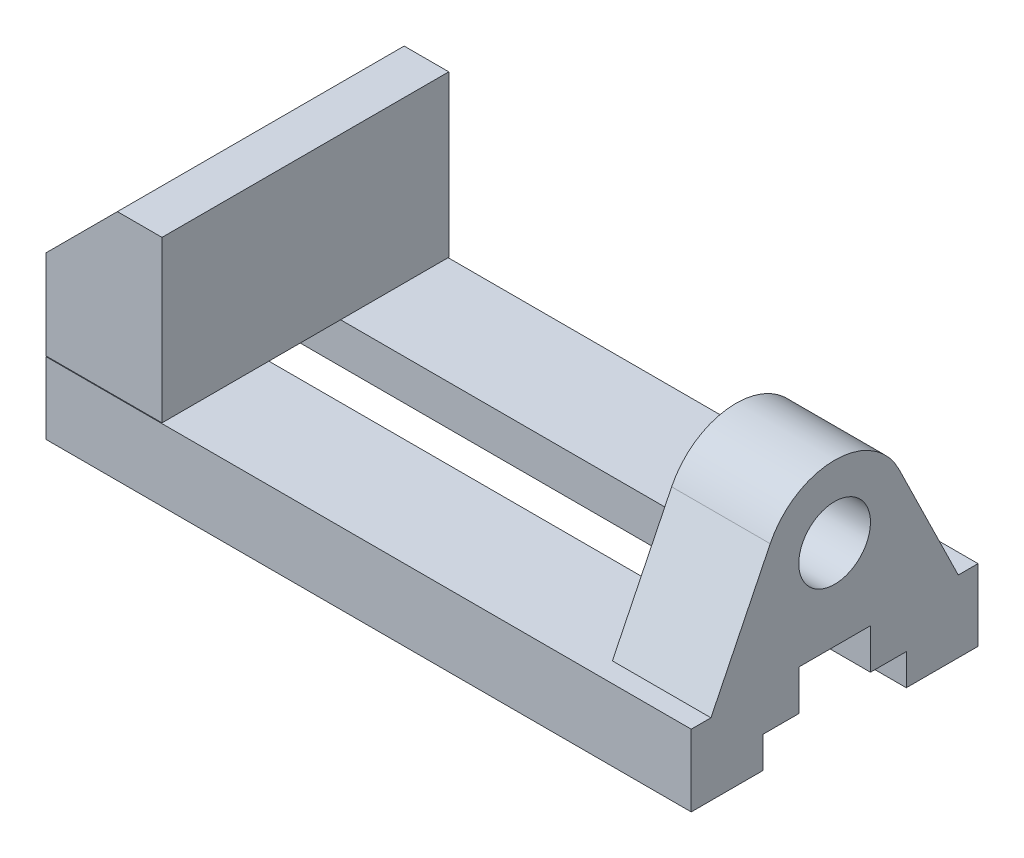
ISO-10303-21;
HEADER;
FILE_DESCRIPTION(('STEP AP214'),'2;1');
FILE_NAME('part.step','',(''),(''),'','','');
FILE_SCHEMA(('AUTOMOTIVE_DESIGN { 1 0 10303 214 1 1 1 1 }'));
ENDSEC;
DATA;
#1=APPLICATION_CONTEXT('core data for automotive mechanical design processes');
#2=APPLICATION_PROTOCOL_DEFINITION('international standard','automotive_design',2000,#1);
#3=PRODUCT_CONTEXT('',#1,'mechanical');
#4=PRODUCT('Part','Part','',(#3));
#5=PRODUCT_RELATED_PRODUCT_CATEGORY('part','',(#4));
#6=PRODUCT_DEFINITION_FORMATION('','',#4);
#7=PRODUCT_DEFINITION_CONTEXT('part definition',#1,'design');
#8=PRODUCT_DEFINITION('design','',#6,#7);
#9=PRODUCT_DEFINITION_SHAPE('','',#8);
#10=(LENGTH_UNIT() NAMED_UNIT(*) SI_UNIT(.MILLI.,.METRE.));
#11=(NAMED_UNIT(*) PLANE_ANGLE_UNIT() SI_UNIT($,.RADIAN.));
#12=(NAMED_UNIT(*) SI_UNIT($,.STERADIAN.) SOLID_ANGLE_UNIT());
#13=UNCERTAINTY_MEASURE_WITH_UNIT(LENGTH_MEASURE(1.E-05),#10,'distance_accuracy_value','');
#14=(GEOMETRIC_REPRESENTATION_CONTEXT(3) GLOBAL_UNCERTAINTY_ASSIGNED_CONTEXT((#13)) GLOBAL_UNIT_ASSIGNED_CONTEXT((#10,
#11,#12)) REPRESENTATION_CONTEXT('',''));
#15=CARTESIAN_POINT('',(0.,0.,0.));
#16=DIRECTION('',(0.,0.,1.));
#17=DIRECTION('',(1.,0.,0.));
#18=AXIS2_PLACEMENT_3D('',#15,#16,#17);
#19=CARTESIAN_POINT('',(-72.,8.15004747972741,-32.));
#20=DIRECTION('',(-1.,0.,0.));
#21=DIRECTION('',(0.,0.,1.));
#22=AXIS2_PLACEMENT_3D('',#19,#20,#21);
#23=PLANE('',#22);
#24=DIRECTION('',(0.,-1.,0.));
#25=VECTOR('',#24,1.);
#26=CARTESIAN_POINT('',(-72.,8.15004747972741,32.));
#27=LINE('',#26,#25);
#28=CARTESIAN_POINT('',(-72.,28.0666877687677,32.));
#29=VERTEX_POINT('',#28);
#30=CARTESIAN_POINT('',(-72.,8.15004747972741,32.));
#31=VERTEX_POINT('',#30);
#32=EDGE_CURVE('E120',#29,#31,#27,.T.);
#33=ORIENTED_EDGE('',*,*,#32,.F.);
#34=DIRECTION('',(0.,0.,1.));
#35=VECTOR('',#34,1.);
#36=CARTESIAN_POINT('',(-72.,28.0666877687677,-32.));
#37=LINE('',#36,#35);
#38=CARTESIAN_POINT('',(-72.,28.0666877687677,-32.));
#39=VERTEX_POINT('',#38);
#40=EDGE_CURVE('E12',#39,#29,#37,.T.);
#41=ORIENTED_EDGE('',*,*,#40,.F.);
#42=DIRECTION('',(0.,-1.,0.));
#43=VECTOR('',#42,1.);
#44=CARTESIAN_POINT('',(-72.,8.15004747972741,-32.));
#45=LINE('',#44,#43);
#46=CARTESIAN_POINT('',(-72.,8.15004747972741,-32.));
#47=VERTEX_POINT('',#46);
#48=EDGE_CURVE('E115',#39,#47,#45,.T.);
#49=ORIENTED_EDGE('',*,*,#48,.T.);
#50=DIRECTION('',(0.,0.,1.));
#51=VECTOR('',#50,1.);
#52=CARTESIAN_POINT('',(-72.,8.15004747972741,-32.));
#53=LINE('',#52,#51);
#54=EDGE_CURVE('E46',#47,#31,#53,.T.);
#55=ORIENTED_EDGE('',*,*,#54,.T.);
#56=EDGE_LOOP('',(#33,#41,#49,#55));
#57=FACE_BOUND('',#56,.T.);
#58=ADVANCED_FACE('F43',(#57),#23,.T.);
#59=CARTESIAN_POINT('',(-56.0666877687677,44.,-32.));
#60=DIRECTION('',(-0.707106781186547,0.707106781186548,0.));
#61=DIRECTION('',(-0.707106781186548,-0.707106781186547,0.));
#62=AXIS2_PLACEMENT_3D('',#59,#60,#61);
#63=PLANE('',#62);
#64=DIRECTION('',(-0.707106781186548,-0.707106781186548,0.));
#65=VECTOR('',#64,1.);
#66=CARTESIAN_POINT('',(-56.0666877687677,44.,32.));
#67=LINE('',#66,#65);
#68=CARTESIAN_POINT('',(-56.0666877687677,44.,32.));
#69=VERTEX_POINT('',#68);
#70=EDGE_CURVE('E129',#69,#29,#67,.T.);
#71=ORIENTED_EDGE('',*,*,#70,.F.);
#72=DIRECTION('',(0.,0.,1.));
#73=VECTOR('',#72,1.);
#74=CARTESIAN_POINT('',(-56.0666877687677,44.,-32.));
#75=LINE('',#74,#73);
#76=CARTESIAN_POINT('',(-56.0666877687677,44.,-32.));
#77=VERTEX_POINT('',#76);
#78=EDGE_CURVE('E52',#77,#69,#75,.T.);
#79=ORIENTED_EDGE('',*,*,#78,.F.);
#80=DIRECTION('',(-0.707106781186548,-0.707106781186548,0.));
#81=VECTOR('',#80,1.);
#82=CARTESIAN_POINT('',(-56.0666877687677,44.,-32.));
#83=LINE('',#82,#81);
#84=EDGE_CURVE('E110',#77,#39,#83,.T.);
#85=ORIENTED_EDGE('',*,*,#84,.T.);
#86=ORIENTED_EDGE('',*,*,#40,.T.);
#87=EDGE_LOOP('',(#71,#79,#85,#86));
#88=FACE_BOUND('',#87,.T.);
#89=ADVANCED_FACE('F135',(#88),#63,.T.);
#90=CARTESIAN_POINT('',(-56.0666877687677,44.,-32.));
#91=DIRECTION('',(0.,1.,0.));
#92=DIRECTION('',(0.,0.,1.));
#93=AXIS2_PLACEMENT_3D('',#90,#91,#92);
#94=PLANE('',#93);
#95=DIRECTION('',(-1.,0.,0.));
#96=VECTOR('',#95,1.);
#97=CARTESIAN_POINT('',(-56.0666877687677,44.,32.));
#98=LINE('',#97,#96);
#99=CARTESIAN_POINT('',(-46.1083676242476,44.,32.));
#100=VERTEX_POINT('',#99);
#101=EDGE_CURVE('E99',#100,#69,#98,.T.);
#102=ORIENTED_EDGE('',*,*,#101,.F.);
#103=DIRECTION('',(0.,0.,1.));
#104=VECTOR('',#103,1.);
#105=CARTESIAN_POINT('',(-46.1083676242476,44.,-32.));
#106=LINE('',#105,#104);
#107=CARTESIAN_POINT('',(-46.1083676242476,44.,-32.));
#108=VERTEX_POINT('',#107);
#109=EDGE_CURVE('E94',#108,#100,#106,.T.);
#110=ORIENTED_EDGE('',*,*,#109,.F.);
#111=DIRECTION('',(-1.,0.,0.));
#112=VECTOR('',#111,1.);
#113=CARTESIAN_POINT('',(-56.0666877687677,44.,-32.));
#114=LINE('',#113,#112);
#115=EDGE_CURVE('E97',#108,#77,#114,.T.);
#116=ORIENTED_EDGE('',*,*,#115,.T.);
#117=ORIENTED_EDGE('',*,*,#78,.T.);
#118=EDGE_LOOP('',(#102,#110,#116,#117));
#119=FACE_BOUND('',#118,.T.);
#120=ADVANCED_FACE('F96',(#119),#94,.T.);
#121=CARTESIAN_POINT('',(-46.1083676242476,8.15004747972741,-32.));
#122=DIRECTION('',(1.,0.,0.));
#123=DIRECTION('',(0.,0.,-1.));
#124=AXIS2_PLACEMENT_3D('',#121,#122,#123);
#125=PLANE('',#124);
#126=DIRECTION('',(0.,1.,0.));
#127=VECTOR('',#126,1.);
#128=CARTESIAN_POINT('',(-46.1083676242476,8.15004747972741,32.));
#129=LINE('',#128,#127);
#130=CARTESIAN_POINT('',(-46.1083676242476,8.15004747972741,32.));
#131=VERTEX_POINT('',#130);
#132=EDGE_CURVE('E126',#131,#100,#129,.T.);
#133=ORIENTED_EDGE('',*,*,#132,.F.);
#134=DIRECTION('',(0.,0.,1.));
#135=VECTOR('',#134,1.);
#136=CARTESIAN_POINT('',(-46.1083676242476,8.15004747972741,-32.));
#137=LINE('',#136,#135);
#138=CARTESIAN_POINT('',(-46.1083676242476,8.15004747972741,-32.));
#139=VERTEX_POINT('',#138);
#140=EDGE_CURVE('E104',#139,#131,#137,.T.);
#141=ORIENTED_EDGE('',*,*,#140,.F.);
#142=DIRECTION('',(0.,1.,0.));
#143=VECTOR('',#142,1.);
#144=CARTESIAN_POINT('',(-46.1083676242476,8.15004747972741,-32.));
#145=LINE('',#144,#143);
#146=EDGE_CURVE('E109',#139,#108,#145,.T.);
#147=ORIENTED_EDGE('',*,*,#146,.T.);
#148=ORIENTED_EDGE('',*,*,#109,.T.);
#149=EDGE_LOOP('',(#133,#141,#147,#148));
#150=FACE_BOUND('',#149,.T.);
#151=ADVANCED_FACE('F112',(#150),#125,.T.);
#152=CARTESIAN_POINT('',(-72.,8.15004747972741,-32.));
#153=DIRECTION('',(0.,-1.,0.));
#154=DIRECTION('',(1.,0.,0.));
#155=AXIS2_PLACEMENT_3D('',#152,#153,#154);
#156=PLANE('',#155);
#157=DIRECTION('',(1.,0.,0.));
#158=VECTOR('',#157,1.);
#159=CARTESIAN_POINT('',(-72.,8.15004747972741,32.));
#160=LINE('',#159,#158);
#161=EDGE_CURVE('E123',#31,#131,#160,.T.);
#162=ORIENTED_EDGE('',*,*,#161,.F.);
#163=ORIENTED_EDGE('',*,*,#54,.F.);
#164=DIRECTION('',(1.,0.,0.));
#165=VECTOR('',#164,1.);
#166=CARTESIAN_POINT('',(-72.,8.15004747972741,-32.));
#167=LINE('',#166,#165);
#168=EDGE_CURVE('E113',#47,#139,#167,.T.);
#169=ORIENTED_EDGE('',*,*,#168,.T.);
#170=ORIENTED_EDGE('',*,*,#140,.T.);
#171=EDGE_LOOP('',(#162,#163,#169,#170));
#172=FACE_BOUND('',#171,.T.);
#173=ADVANCED_FACE('F132',(#172),#156,.T.);
#174=CARTESIAN_POINT('',(0.,0.,-32.));
#175=DIRECTION('',(0.,0.,-1.));
#176=DIRECTION('',(-1.,0.,0.));
#177=AXIS2_PLACEMENT_3D('',#174,#175,#176);
#178=PLANE('',#177);
#179=ORIENTED_EDGE('',*,*,#48,.F.);
#180=ORIENTED_EDGE('',*,*,#84,.F.);
#181=ORIENTED_EDGE('',*,*,#115,.F.);
#182=ORIENTED_EDGE('',*,*,#146,.F.);
#183=ORIENTED_EDGE('',*,*,#168,.F.);
#184=EDGE_LOOP('',(#179,#180,#181,#182,#183));
#185=FACE_BOUND('',#184,.T.);
#186=ADVANCED_FACE('F108',(#185),#178,.T.);
#187=CARTESIAN_POINT('',(0.,0.,32.));
#188=DIRECTION('',(0.,0.,-1.));
#189=DIRECTION('',(-1.,0.,0.));
#190=AXIS2_PLACEMENT_3D('',#187,#188,#189);
#191=PLANE('',#190);
#192=ORIENTED_EDGE('',*,*,#32,.T.);
#193=ORIENTED_EDGE('',*,*,#161,.T.);
#194=ORIENTED_EDGE('',*,*,#132,.T.);
#195=ORIENTED_EDGE('',*,*,#101,.T.);
#196=ORIENTED_EDGE('',*,*,#70,.T.);
#197=EDGE_LOOP('',(#192,#193,#194,#195,#196));
#198=FACE_BOUND('',#197,.T.);
#199=ADVANCED_FACE('F134',(#198),#191,.F.);
#200=CLOSED_SHELL('',(#58,#89,#120,#151,#173,#186,#199));
#201=MANIFOLD_SOLID_BREP('B2',#200);
#202=CARTESIAN_POINT('',(-72.,7.99999999999999,32.));
#203=DIRECTION('',(1.,0.,0.));
#204=DIRECTION('',(0.,0.,-1.));
#205=AXIS2_PLACEMENT_3D('',#202,#203,#204);
#206=PLANE('',#205);
#207=DIRECTION('',(0.,0.,1.));
#208=VECTOR('',#207,1.);
#209=CARTESIAN_POINT('',(-72.,-0.999999999999851,-16.));
#210=LINE('',#209,#208);
#211=CARTESIAN_POINT('',(-72.,-0.999999999999851,-16.));
#212=VERTEX_POINT('',#211);
#213=CARTESIAN_POINT('',(-72.,-0.999999999999854,-8.00000000000001));
#214=VERTEX_POINT('',#213);
#215=EDGE_CURVE('E347',#212,#214,#210,.T.);
#216=ORIENTED_EDGE('',*,*,#215,.T.);
#217=DIRECTION('',(0.,1.,0.));
#218=VECTOR('',#217,1.);
#219=CARTESIAN_POINT('',(-72.,-0.999999999999854,-8.00000000000001));
#220=LINE('',#219,#218);
#221=CARTESIAN_POINT('',(-72.,8.00000000000014,-8.));
#222=VERTEX_POINT('',#221);
#223=EDGE_CURVE('E323',#214,#222,#220,.T.);
#224=ORIENTED_EDGE('',*,*,#223,.T.);
#225=DIRECTION('',(0.,0.,-1.));
#226=VECTOR('',#225,1.);
#227=CARTESIAN_POINT('',(-72.,7.99999999999999,32.));
#228=LINE('',#227,#226);
#229=CARTESIAN_POINT('',(-72.,7.99999999999999,-32.));
#230=VERTEX_POINT('',#229);
#231=EDGE_CURVE('E427',#222,#230,#228,.T.);
#232=ORIENTED_EDGE('',*,*,#231,.T.);
#233=DIRECTION('',(0.,-1.,0.));
#234=VECTOR('',#233,1.);
#235=CARTESIAN_POINT('',(-72.,7.99999999999999,-32.));
#236=LINE('',#235,#234);
#237=CARTESIAN_POINT('',(-72.,-8.00000000000001,-32.));
#238=VERTEX_POINT('',#237);
#239=EDGE_CURVE('E415',#230,#238,#236,.T.);
#240=ORIENTED_EDGE('',*,*,#239,.T.);
#241=DIRECTION('',(0.,0.,-1.));
#242=VECTOR('',#241,1.);
#243=CARTESIAN_POINT('',(-72.,-8.00000000000001,32.));
#244=LINE('',#243,#242);
#245=CARTESIAN_POINT('',(-72.,-7.99999999999986,-16.));
#246=VERTEX_POINT('',#245);
#247=EDGE_CURVE('E201',#246,#238,#244,.T.);
#248=ORIENTED_EDGE('',*,*,#247,.F.);
#249=DIRECTION('',(0.,1.,0.));
#250=VECTOR('',#249,1.);
#251=CARTESIAN_POINT('',(-72.,-7.99999999999986,-16.));
#252=LINE('',#251,#250);
#253=EDGE_CURVE('E344',#246,#212,#252,.T.);
#254=ORIENTED_EDGE('',*,*,#253,.T.);
#255=EDGE_LOOP('',(#216,#224,#232,#240,#248,#254));
#256=FACE_BOUND('',#255,.T.);
#257=ADVANCED_FACE('F193',(#256),#206,.F.);
#258=CARTESIAN_POINT('',(72.,-7.99999999999999,32.));
#259=DIRECTION('',(0.,1.,0.));
#260=DIRECTION('',(-1.,0.,0.));
#261=AXIS2_PLACEMENT_3D('',#258,#259,#260);
#262=PLANE('',#261);
#263=DIRECTION('',(0.,0.,-1.));
#264=VECTOR('',#263,1.);
#265=CARTESIAN_POINT('',(72.,-7.99999999999999,32.));
#266=LINE('',#265,#264);
#267=CARTESIAN_POINT('',(72.,-7.99999999999998,-16.));
#268=VERTEX_POINT('',#267);
#269=CARTESIAN_POINT('',(72.,-7.99999999999999,-32.));
#270=VERTEX_POINT('',#269);
#271=EDGE_CURVE('E441',#268,#270,#266,.T.);
#272=ORIENTED_EDGE('',*,*,#271,.F.);
#273=DIRECTION('',(1.,0.,0.));
#274=VECTOR('',#273,1.);
#275=CARTESIAN_POINT('',(-72.,-7.99999999999986,-16.));
#276=LINE('',#275,#274);
#277=EDGE_CURVE('E375',#246,#268,#276,.T.);
#278=ORIENTED_EDGE('',*,*,#277,.F.);
#279=ORIENTED_EDGE('',*,*,#247,.T.);
#280=DIRECTION('',(1.,0.,0.));
#281=VECTOR('',#280,1.);
#282=CARTESIAN_POINT('',(72.,-7.99999999999999,-32.));
#283=LINE('',#282,#281);
#284=EDGE_CURVE('E430',#238,#270,#283,.T.);
#285=ORIENTED_EDGE('',*,*,#284,.T.);
#286=EDGE_LOOP('',(#272,#278,#279,#285));
#287=FACE_BOUND('',#286,.T.);
#288=ADVANCED_FACE('F458',(#287),#262,.F.);
#289=CARTESIAN_POINT('',(72.,8.00000000000001,32.));
#290=DIRECTION('',(0.,-1.,0.));
#291=DIRECTION('',(1.,0.,0.));
#292=AXIS2_PLACEMENT_3D('',#289,#290,#291);
#293=PLANE('',#292);
#294=DIRECTION('',(0.,0.,1.));
#295=VECTOR('',#294,1.);
#296=CARTESIAN_POINT('',(50.,8.00000000000001,32.));
#297=LINE('',#296,#295);
#298=CARTESIAN_POINT('',(50.,8.00000000000001,8.));
#299=VERTEX_POINT('',#298);
#300=CARTESIAN_POINT('',(50.,8.00000000000001,27.5968842437562));
#301=VERTEX_POINT('',#300);
#302=EDGE_CURVE('E407',#299,#301,#297,.T.);
#303=ORIENTED_EDGE('',*,*,#302,.F.);
#304=DIRECTION('',(1.,0.,0.));
#305=VECTOR('',#304,1.);
#306=CARTESIAN_POINT('',(-72.,8.00000000000014,8.));
#307=LINE('',#306,#305);
#308=CARTESIAN_POINT('',(-72.,8.00000000000014,8.));
#309=VERTEX_POINT('',#308);
#310=EDGE_CURVE('E208',#309,#299,#307,.T.);
#311=ORIENTED_EDGE('',*,*,#310,.F.);
#312=CARTESIAN_POINT('',(-72.,7.99999999999999,32.));
#313=VERTEX_POINT('',#312);
#314=EDGE_CURVE('E336',#313,#309,#228,.T.);
#315=ORIENTED_EDGE('',*,*,#314,.F.);
#316=DIRECTION('',(-1.,0.,0.));
#317=VECTOR('',#316,1.);
#318=CARTESIAN_POINT('',(72.,8.00000000000001,32.));
#319=LINE('',#318,#317);
#320=CARTESIAN_POINT('',(72.,8.00000000000001,32.));
#321=VERTEX_POINT('',#320);
#322=EDGE_CURVE('E425',#321,#313,#319,.T.);
#323=ORIENTED_EDGE('',*,*,#322,.F.);
#324=DIRECTION('',(0.,0.,-1.));
#325=VECTOR('',#324,1.);
#326=CARTESIAN_POINT('',(72.,8.00000000000001,32.));
#327=LINE('',#326,#325);
#328=CARTESIAN_POINT('',(72.,8.00000000000001,27.5968842437562));
#329=VERTEX_POINT('',#328);
#330=EDGE_CURVE('E440',#321,#329,#327,.T.);
#331=ORIENTED_EDGE('',*,*,#330,.T.);
#332=DIRECTION('',(1.,0.,0.));
#333=VECTOR('',#332,1.);
#334=CARTESIAN_POINT('',(50.,8.00000000000003,27.5968842437562));
#335=LINE('',#334,#333);
#336=EDGE_CURVE('E397',#301,#329,#335,.T.);
#337=ORIENTED_EDGE('',*,*,#336,.F.);
#338=EDGE_LOOP('',(#303,#311,#315,#323,#331,#337));
#339=FACE_BOUND('',#338,.T.);
#340=ADVANCED_FACE('F480',(#339),#293,.F.);
#341=ORIENTED_EDGE('',*,*,#314,.T.);
#342=DIRECTION('',(0.,-1.,0.));
#343=VECTOR('',#342,1.);
#344=CARTESIAN_POINT('',(-72.,-0.999999999999868,8.));
#345=LINE('',#344,#343);
#346=CARTESIAN_POINT('',(-72.,-0.999999999999868,8.));
#347=VERTEX_POINT('',#346);
#348=EDGE_CURVE('E316',#309,#347,#345,.T.);
#349=ORIENTED_EDGE('',*,*,#348,.T.);
#350=DIRECTION('',(0.,0.,1.));
#351=VECTOR('',#350,1.);
#352=CARTESIAN_POINT('',(-72.,-0.999999999999868,16.));
#353=LINE('',#352,#351);
#354=CARTESIAN_POINT('',(-72.,-0.999999999999868,16.));
#355=VERTEX_POINT('',#354);
#356=EDGE_CURVE('E326',#347,#355,#353,.T.);
#357=ORIENTED_EDGE('',*,*,#356,.T.);
#358=DIRECTION('',(0.,-1.,0.));
#359=VECTOR('',#358,1.);
#360=CARTESIAN_POINT('',(-72.,-7.99999999999987,16.));
#361=LINE('',#360,#359);
#362=CARTESIAN_POINT('',(-72.,-7.99999999999987,16.));
#363=VERTEX_POINT('',#362);
#364=EDGE_CURVE('E331',#355,#363,#361,.T.);
#365=ORIENTED_EDGE('',*,*,#364,.T.);
#366=CARTESIAN_POINT('',(-72.,-8.00000000000001,32.));
#367=VERTEX_POINT('',#366);
#368=EDGE_CURVE('E41',#367,#363,#244,.T.);
#369=ORIENTED_EDGE('',*,*,#368,.F.);
#370=DIRECTION('',(0.,-1.,0.));
#371=VECTOR('',#370,1.);
#372=CARTESIAN_POINT('',(-72.,7.99999999999999,32.));
#373=LINE('',#372,#371);
#374=EDGE_CURVE('E417',#313,#367,#373,.T.);
#375=ORIENTED_EDGE('',*,*,#374,.F.);
#376=EDGE_LOOP('',(#341,#349,#357,#365,#369,#375));
#377=FACE_BOUND('',#376,.T.);
#378=ADVANCED_FACE('F195',(#377),#206,.F.);
#379=ORIENTED_EDGE('',*,*,#368,.T.);
#380=DIRECTION('',(1.,0.,0.));
#381=VECTOR('',#380,1.);
#382=CARTESIAN_POINT('',(-72.,-7.99999999999987,16.));
#383=LINE('',#382,#381);
#384=CARTESIAN_POINT('',(72.,-7.99999999999999,16.));
#385=VERTEX_POINT('',#384);
#386=EDGE_CURVE('E377',#363,#385,#383,.T.);
#387=ORIENTED_EDGE('',*,*,#386,.T.);
#388=CARTESIAN_POINT('',(72.,-7.99999999999999,32.));
#389=VERTEX_POINT('',#388);
#390=EDGE_CURVE('E442',#389,#385,#266,.T.);
#391=ORIENTED_EDGE('',*,*,#390,.F.);
#392=DIRECTION('',(1.,0.,0.));
#393=VECTOR('',#392,1.);
#394=CARTESIAN_POINT('',(72.,-7.99999999999999,32.));
#395=LINE('',#394,#393);
#396=EDGE_CURVE('E420',#367,#389,#395,.T.);
#397=ORIENTED_EDGE('',*,*,#396,.F.);
#398=EDGE_LOOP('',(#379,#387,#391,#397));
#399=FACE_BOUND('',#398,.T.);
#400=ADVANCED_FACE('F485',(#399),#262,.F.);
#401=CARTESIAN_POINT('',(72.,8.00000000000001,32.));
#402=DIRECTION('',(-1.,0.,0.));
#403=DIRECTION('',(0.,-1.,0.));
#404=AXIS2_PLACEMENT_3D('',#401,#402,#403);
#405=PLANE('',#404);
#406=DIRECTION('',(0.,0.,1.));
#407=VECTOR('',#406,1.);
#408=CARTESIAN_POINT('',(72.,-0.999999999999976,-16.));
#409=LINE('',#408,#407);
#410=CARTESIAN_POINT('',(72.,-0.999999999999976,-16.));
#411=VERTEX_POINT('',#410);
#412=CARTESIAN_POINT('',(72.,-0.999999999999979,-8.00000000000001));
#413=VERTEX_POINT('',#412);
#414=EDGE_CURVE('E360',#411,#413,#409,.T.);
#415=ORIENTED_EDGE('',*,*,#414,.F.);
#416=DIRECTION('',(0.,1.,0.));
#417=VECTOR('',#416,1.);
#418=CARTESIAN_POINT('',(72.,-7.99999999999998,-16.));
#419=LINE('',#418,#417);
#420=EDGE_CURVE('E357',#268,#411,#419,.T.);
#421=ORIENTED_EDGE('',*,*,#420,.F.);
#422=ORIENTED_EDGE('',*,*,#271,.T.);
#423=DIRECTION('',(0.,1.,0.));
#424=VECTOR('',#423,1.);
#425=CARTESIAN_POINT('',(72.,8.00000000000001,-32.));
#426=LINE('',#425,#424);
#427=CARTESIAN_POINT('',(72.,8.00000000000001,-32.));
#428=VERTEX_POINT('',#427);
#429=EDGE_CURVE('E433',#270,#428,#426,.T.);
#430=ORIENTED_EDGE('',*,*,#429,.T.);
#431=CARTESIAN_POINT('',(72.,8.00000000000001,-27.5968842437562));
#432=VERTEX_POINT('',#431);
#433=EDGE_CURVE('E439',#432,#428,#327,.T.);
#434=ORIENTED_EDGE('',*,*,#433,.F.);
#435=DIRECTION('',(0.,0.89826162196657,0.439461100101006));
#436=VECTOR('',#435,1.);
#437=CARTESIAN_POINT('',(72.,8.00000000000001,-27.5968842437562));
#438=LINE('',#437,#436);
#439=CARTESIAN_POINT('',(72.,35.0313776016161,-14.3721859514651));
#440=VERTEX_POINT('',#439);
#441=EDGE_CURVE('E400',#432,#440,#438,.T.);
#442=ORIENTED_EDGE('',*,*,#441,.T.);
#443=CARTESIAN_POINT('',(72.,28.,0.));
#444=DIRECTION('',(1.,0.,0.));
#445=DIRECTION('',(0.,1.,0.));
#446=AXIS2_PLACEMENT_3D('',#443,#444,#445);
#447=CIRCLE('',#446,16.);
#448=CARTESIAN_POINT('',(72.,35.0313776016161,14.3721859514651));
#449=VERTEX_POINT('',#448);
#450=EDGE_CURVE('E391',#440,#449,#447,.T.);
#451=ORIENTED_EDGE('',*,*,#450,.T.);
#452=DIRECTION('',(0.,-0.89826162196657,0.439461100101006));
#453=VECTOR('',#452,1.);
#454=CARTESIAN_POINT('',(72.,8.00000000000001,27.5968842437562));
#455=LINE('',#454,#453);
#456=EDGE_CURVE('E384',#449,#329,#455,.T.);
#457=ORIENTED_EDGE('',*,*,#456,.T.);
#458=ORIENTED_EDGE('',*,*,#330,.F.);
#459=DIRECTION('',(0.,1.,0.));
#460=VECTOR('',#459,1.);
#461=CARTESIAN_POINT('',(72.,8.00000000000001,32.));
#462=LINE('',#461,#460);
#463=EDGE_CURVE('E423',#389,#321,#462,.T.);
#464=ORIENTED_EDGE('',*,*,#463,.F.);
#465=ORIENTED_EDGE('',*,*,#390,.T.);
#466=DIRECTION('',(0.,-1.,0.));
#467=VECTOR('',#466,1.);
#468=CARTESIAN_POINT('',(72.,-7.99999999999999,16.));
#469=LINE('',#468,#467);
#470=CARTESIAN_POINT('',(72.,-0.999999999999993,16.));
#471=VERTEX_POINT('',#470);
#472=EDGE_CURVE('E355',#471,#385,#469,.T.);
#473=ORIENTED_EDGE('',*,*,#472,.F.);
#474=DIRECTION('',(0.,0.,1.));
#475=VECTOR('',#474,1.);
#476=CARTESIAN_POINT('',(72.,-0.999999999999993,16.));
#477=LINE('',#476,#475);
#478=CARTESIAN_POINT('',(72.,-0.999999999999993,8.));
#479=VERTEX_POINT('',#478);
#480=EDGE_CURVE('E353',#479,#471,#477,.T.);
#481=ORIENTED_EDGE('',*,*,#480,.F.);
#482=DIRECTION('',(0.,-1.,0.));
#483=VECTOR('',#482,1.);
#484=CARTESIAN_POINT('',(72.,-0.999999999999993,8.));
#485=LINE('',#484,#483);
#486=CARTESIAN_POINT('',(72.,8.00000000000001,8.));
#487=VERTEX_POINT('',#486);
#488=EDGE_CURVE('E318',#487,#479,#485,.T.);
#489=ORIENTED_EDGE('',*,*,#488,.F.);
#490=DIRECTION('',(0.,0.,1.));
#491=VECTOR('',#490,1.);
#492=CARTESIAN_POINT('',(72.,8.00000000000002,-8.));
#493=LINE('',#492,#491);
#494=CARTESIAN_POINT('',(72.,8.00000000000002,-8.));
#495=VERTEX_POINT('',#494);
#496=EDGE_CURVE('E337',#495,#487,#493,.T.);
#497=ORIENTED_EDGE('',*,*,#496,.F.);
#498=DIRECTION('',(0.,1.,0.));
#499=VECTOR('',#498,1.);
#500=CARTESIAN_POINT('',(72.,-0.999999999999979,-8.00000000000001));
#501=LINE('',#500,#499);
#502=EDGE_CURVE('E340',#413,#495,#501,.T.);
#503=ORIENTED_EDGE('',*,*,#502,.F.);
#504=EDGE_LOOP('',(#415,#421,#422,#430,#434,#442,#451,#457,#458,#464,#465,#473,#481,#489,#497,#503));
#505=FACE_BOUND('',#504,.T.);
#506=CARTESIAN_POINT('',(72.,28.,0.));
#507=DIRECTION('',(1.,0.,0.));
#508=DIRECTION('',(0.,1.,0.));
#509=AXIS2_PLACEMENT_3D('',#506,#507,#508);
#510=CIRCLE('',#509,8.);
#511=CARTESIAN_POINT('',(72.,36.,0.));
#512=VERTEX_POINT('',#511);
#513=EDGE_CURVE('E366',#512,#512,#510,.T.);
#514=ORIENTED_EDGE('',*,*,#513,.F.);
#515=EDGE_LOOP('',(#514));
#516=FACE_BOUND('',#515,.T.);
#517=ADVANCED_FACE('F451',(#505,#516),#405,.F.);
#518=ORIENTED_EDGE('',*,*,#231,.F.);
#519=DIRECTION('',(1.,0.,0.));
#520=VECTOR('',#519,1.);
#521=CARTESIAN_POINT('',(-72.,8.00000000000014,-8.));
#522=LINE('',#521,#520);
#523=CARTESIAN_POINT('',(50.,8.00000000000004,-8.));
#524=VERTEX_POINT('',#523);
#525=EDGE_CURVE('E368',#222,#524,#522,.T.);
#526=ORIENTED_EDGE('',*,*,#525,.T.);
#527=CARTESIAN_POINT('',(50.,8.00000000000001,-27.5968842437562));
#528=VERTEX_POINT('',#527);
#529=EDGE_CURVE('E216',#528,#524,#297,.T.);
#530=ORIENTED_EDGE('',*,*,#529,.F.);
#531=DIRECTION('',(1.,0.,0.));
#532=VECTOR('',#531,1.);
#533=CARTESIAN_POINT('',(50.,8.00000000000003,-27.5968842437562));
#534=LINE('',#533,#532);
#535=EDGE_CURVE('E410',#528,#432,#534,.T.);
#536=ORIENTED_EDGE('',*,*,#535,.T.);
#537=ORIENTED_EDGE('',*,*,#433,.T.);
#538=DIRECTION('',(-1.,0.,0.));
#539=VECTOR('',#538,1.);
#540=CARTESIAN_POINT('',(72.,8.00000000000001,-32.));
#541=LINE('',#540,#539);
#542=EDGE_CURVE('E421',#428,#230,#541,.T.);
#543=ORIENTED_EDGE('',*,*,#542,.T.);
#544=EDGE_LOOP('',(#518,#526,#530,#536,#537,#543));
#545=FACE_BOUND('',#544,.T.);
#546=ADVANCED_FACE('F464',(#545),#293,.F.);
#547=CARTESIAN_POINT('',(0.,0.,32.));
#548=DIRECTION('',(0.,0.,-1.));
#549=DIRECTION('',(-1.,0.,0.));
#550=AXIS2_PLACEMENT_3D('',#547,#548,#549);
#551=PLANE('',#550);
#552=ORIENTED_EDGE('',*,*,#322,.T.);
#553=ORIENTED_EDGE('',*,*,#374,.T.);
#554=ORIENTED_EDGE('',*,*,#396,.T.);
#555=ORIENTED_EDGE('',*,*,#463,.T.);
#556=EDGE_LOOP('',(#552,#553,#554,#555));
#557=FACE_BOUND('',#556,.T.);
#558=ADVANCED_FACE('F482',(#557),#551,.F.);
#559=CARTESIAN_POINT('',(0.,0.,-32.));
#560=DIRECTION('',(0.,0.,-1.));
#561=DIRECTION('',(-1.,0.,0.));
#562=AXIS2_PLACEMENT_3D('',#559,#560,#561);
#563=PLANE('',#562);
#564=ORIENTED_EDGE('',*,*,#429,.F.);
#565=ORIENTED_EDGE('',*,*,#284,.F.);
#566=ORIENTED_EDGE('',*,*,#239,.F.);
#567=ORIENTED_EDGE('',*,*,#542,.F.);
#568=EDGE_LOOP('',(#564,#565,#566,#567));
#569=FACE_BOUND('',#568,.T.);
#570=ADVANCED_FACE('F462',(#569),#563,.T.);
#571=CARTESIAN_POINT('',(50.,28.,0.));
#572=DIRECTION('',(1.,0.,0.));
#573=DIRECTION('',(0.,1.,0.));
#574=AXIS2_PLACEMENT_3D('',#571,#572,#573);
#575=PLANE('',#574);
#576=CARTESIAN_POINT('',(50.,28.,0.));
#577=DIRECTION('',(1.,0.,0.));
#578=DIRECTION('',(0.,1.,0.));
#579=AXIS2_PLACEMENT_3D('',#576,#577,#578);
#580=CIRCLE('',#579,8.);
#581=CARTESIAN_POINT('',(50.,36.,0.));
#582=VERTEX_POINT('',#581);
#583=EDGE_CURVE('E381',#582,#582,#580,.T.);
#584=ORIENTED_EDGE('',*,*,#583,.T.);
#585=EDGE_LOOP('',(#584));
#586=FACE_BOUND('',#585,.T.);
#587=DIRECTION('',(0.,0.89826162196657,0.439461100101006));
#588=VECTOR('',#587,1.);
#589=CARTESIAN_POINT('',(50.,8.00000000000003,-27.5968842437562));
#590=LINE('',#589,#588);
#591=CARTESIAN_POINT('',(50.,35.0313776016161,-14.3721859514651));
#592=VERTEX_POINT('',#591);
#593=EDGE_CURVE('E390',#528,#592,#590,.T.);
#594=ORIENTED_EDGE('',*,*,#593,.F.);
#595=ORIENTED_EDGE('',*,*,#529,.T.);
#596=EDGE_CURVE('E416',#524,#299,#297,.T.);
#597=ORIENTED_EDGE('',*,*,#596,.T.);
#598=ORIENTED_EDGE('',*,*,#302,.T.);
#599=DIRECTION('',(0.,-0.89826162196657,0.439461100101006));
#600=VECTOR('',#599,1.);
#601=CARTESIAN_POINT('',(50.,8.00000000000003,27.5968842437562));
#602=LINE('',#601,#600);
#603=CARTESIAN_POINT('',(50.,35.0313776016161,14.3721859514651));
#604=VERTEX_POINT('',#603);
#605=EDGE_CURVE('E387',#604,#301,#602,.T.);
#606=ORIENTED_EDGE('',*,*,#605,.F.);
#607=CARTESIAN_POINT('',(50.,28.,0.));
#608=DIRECTION('',(1.,0.,0.));
#609=DIRECTION('',(0.,1.,0.));
#610=AXIS2_PLACEMENT_3D('',#607,#608,#609);
#611=CIRCLE('',#610,16.);
#612=EDGE_CURVE('E394',#592,#604,#611,.T.);
#613=ORIENTED_EDGE('',*,*,#612,.F.);
#614=EDGE_LOOP('',(#594,#595,#597,#598,#606,#613));
#615=FACE_BOUND('',#614,.T.);
#616=ADVANCED_FACE('F586',(#586,#615),#575,.F.);
#617=CARTESIAN_POINT('',(50.,8.00000000000003,27.5968842437562));
#618=DIRECTION('',(0.,0.439461100101006,0.89826162196657));
#619=DIRECTION('',(0.,-0.89826162196657,0.439461100101006));
#620=AXIS2_PLACEMENT_3D('',#617,#618,#619);
#621=PLANE('',#620);
#622=ORIENTED_EDGE('',*,*,#456,.F.);
#623=DIRECTION('',(1.,0.,0.));
#624=VECTOR('',#623,1.);
#625=CARTESIAN_POINT('',(50.,35.0313776016161,14.3721859514651));
#626=LINE('',#625,#624);
#627=EDGE_CURVE('E405',#604,#449,#626,.T.);
#628=ORIENTED_EDGE('',*,*,#627,.F.);
#629=ORIENTED_EDGE('',*,*,#605,.T.);
#630=ORIENTED_EDGE('',*,*,#336,.T.);
#631=EDGE_LOOP('',(#622,#628,#629,#630));
#632=FACE_BOUND('',#631,.T.);
#633=ADVANCED_FACE('F474',(#632),#621,.T.);
#634=CARTESIAN_POINT('',(50.,28.,0.));
#635=DIRECTION('',(1.,0.,0.));
#636=DIRECTION('',(0.,1.,0.));
#637=AXIS2_PLACEMENT_3D('',#634,#635,#636);
#638=CYLINDRICAL_SURFACE('',#637,16.);
#639=ORIENTED_EDGE('',*,*,#450,.F.);
#640=DIRECTION('',(1.,0.,0.));
#641=VECTOR('',#640,1.);
#642=CARTESIAN_POINT('',(50.,35.0313776016161,-14.3721859514651));
#643=LINE('',#642,#641);
#644=EDGE_CURVE('E408',#592,#440,#643,.T.);
#645=ORIENTED_EDGE('',*,*,#644,.F.);
#646=ORIENTED_EDGE('',*,*,#612,.T.);
#647=ORIENTED_EDGE('',*,*,#627,.T.);
#648=EDGE_LOOP('',(#639,#645,#646,#647));
#649=FACE_BOUND('',#648,.T.);
#650=ADVANCED_FACE('F469',(#649),#638,.T.);
#651=CARTESIAN_POINT('',(50.,8.00000000000003,-27.5968842437562));
#652=DIRECTION('',(0.,0.439461100101006,-0.89826162196657));
#653=DIRECTION('',(0.,0.89826162196657,0.439461100101006));
#654=AXIS2_PLACEMENT_3D('',#651,#652,#653);
#655=PLANE('',#654);
#656=ORIENTED_EDGE('',*,*,#441,.F.);
#657=ORIENTED_EDGE('',*,*,#535,.F.);
#658=ORIENTED_EDGE('',*,*,#593,.T.);
#659=ORIENTED_EDGE('',*,*,#644,.T.);
#660=EDGE_LOOP('',(#656,#657,#658,#659));
#661=FACE_BOUND('',#660,.T.);
#662=ADVANCED_FACE('F559',(#661),#655,.T.);
#663=CARTESIAN_POINT('',(50.,28.,0.));
#664=DIRECTION('',(1.,0.,0.));
#665=DIRECTION('',(0.,1.,0.));
#666=AXIS2_PLACEMENT_3D('',#663,#664,#665);
#667=CYLINDRICAL_SURFACE('',#666,8.);
#668=ORIENTED_EDGE('',*,*,#583,.F.);
#669=EDGE_LOOP('',(#668));
#670=FACE_BOUND('',#669,.T.);
#671=ORIENTED_EDGE('',*,*,#513,.T.);
#672=EDGE_LOOP('',(#671));
#673=FACE_BOUND('',#672,.T.);
#674=ADVANCED_FACE('F555',(#670,#673),#667,.F.);
#675=CARTESIAN_POINT('',(-72.,8.00000000000014,-8.));
#676=DIRECTION('',(0.,1.,0.));
#677=DIRECTION('',(-1.,0.,0.));
#678=AXIS2_PLACEMENT_3D('',#675,#676,#677);
#679=PLANE('',#678);
#680=EDGE_CURVE('E370',#524,#495,#522,.T.);
#681=ORIENTED_EDGE('',*,*,#680,.T.);
#682=ORIENTED_EDGE('',*,*,#496,.T.);
#683=EDGE_CURVE('E367',#299,#487,#307,.T.);
#684=ORIENTED_EDGE('',*,*,#683,.F.);
#685=ORIENTED_EDGE('',*,*,#596,.F.);
#686=EDGE_LOOP('',(#681,#682,#684,#685));
#687=FACE_BOUND('',#686,.T.);
#688=ADVANCED_FACE('F491',(#687),#679,.F.);
#689=CARTESIAN_POINT('',(-72.,-0.999999999999868,8.));
#690=DIRECTION('',(0.,0.,1.));
#691=DIRECTION('',(1.,0.,0.));
#692=AXIS2_PLACEMENT_3D('',#689,#690,#691);
#693=PLANE('',#692);
#694=ORIENTED_EDGE('',*,*,#488,.T.);
#695=DIRECTION('',(1.,0.,0.));
#696=VECTOR('',#695,1.);
#697=CARTESIAN_POINT('',(-72.,-0.999999999999868,8.));
#698=LINE('',#697,#696);
#699=EDGE_CURVE('E312',#347,#479,#698,.T.);
#700=ORIENTED_EDGE('',*,*,#699,.F.);
#701=ORIENTED_EDGE('',*,*,#348,.F.);
#702=ORIENTED_EDGE('',*,*,#310,.T.);
#703=ORIENTED_EDGE('',*,*,#683,.T.);
#704=EDGE_LOOP('',(#694,#700,#701,#702,#703));
#705=FACE_BOUND('',#704,.T.);
#706=ADVANCED_FACE('F314',(#705),#693,.F.);
#707=CARTESIAN_POINT('',(-72.,-0.999999999999854,-8.00000000000001));
#708=DIRECTION('',(0.,0.,-1.));
#709=DIRECTION('',(0.,1.,0.));
#710=AXIS2_PLACEMENT_3D('',#707,#708,#709);
#711=PLANE('',#710);
#712=ORIENTED_EDGE('',*,*,#502,.T.);
#713=ORIENTED_EDGE('',*,*,#680,.F.);
#714=ORIENTED_EDGE('',*,*,#525,.F.);
#715=ORIENTED_EDGE('',*,*,#223,.F.);
#716=DIRECTION('',(1.,0.,0.));
#717=VECTOR('',#716,1.);
#718=CARTESIAN_POINT('',(-72.,-0.999999999999854,-8.00000000000001));
#719=LINE('',#718,#717);
#720=EDGE_CURVE('E371',#214,#413,#719,.T.);
#721=ORIENTED_EDGE('',*,*,#720,.T.);
#722=EDGE_LOOP('',(#712,#713,#714,#715,#721));
#723=FACE_BOUND('',#722,.T.);
#724=ADVANCED_FACE('F495',(#723),#711,.F.);
#725=CARTESIAN_POINT('',(-72.,-0.999999999999851,-16.));
#726=DIRECTION('',(0.,1.,0.));
#727=DIRECTION('',(-1.,0.,0.));
#728=AXIS2_PLACEMENT_3D('',#725,#726,#727);
#729=PLANE('',#728);
#730=ORIENTED_EDGE('',*,*,#414,.T.);
#731=ORIENTED_EDGE('',*,*,#720,.F.);
#732=ORIENTED_EDGE('',*,*,#215,.F.);
#733=DIRECTION('',(1.,0.,0.));
#734=VECTOR('',#733,1.);
#735=CARTESIAN_POINT('',(-72.,-0.999999999999851,-16.));
#736=LINE('',#735,#734);
#737=EDGE_CURVE('E373',#212,#411,#736,.T.);
#738=ORIENTED_EDGE('',*,*,#737,.T.);
#739=EDGE_LOOP('',(#730,#731,#732,#738));
#740=FACE_BOUND('',#739,.T.);
#741=ADVANCED_FACE('F499',(#740),#729,.F.);
#742=CARTESIAN_POINT('',(-72.,-7.99999999999986,-16.));
#743=DIRECTION('',(0.,0.,-1.));
#744=DIRECTION('',(0.,1.,0.));
#745=AXIS2_PLACEMENT_3D('',#742,#743,#744);
#746=PLANE('',#745);
#747=ORIENTED_EDGE('',*,*,#420,.T.);
#748=ORIENTED_EDGE('',*,*,#737,.F.);
#749=ORIENTED_EDGE('',*,*,#253,.F.);
#750=ORIENTED_EDGE('',*,*,#277,.T.);
#751=EDGE_LOOP('',(#747,#748,#749,#750));
#752=FACE_BOUND('',#751,.T.);
#753=ADVANCED_FACE('F501',(#752),#746,.F.);
#754=CARTESIAN_POINT('',(-72.,-7.99999999999987,16.));
#755=DIRECTION('',(0.,0.,1.));
#756=DIRECTION('',(1.,0.,0.));
#757=AXIS2_PLACEMENT_3D('',#754,#755,#756);
#758=PLANE('',#757);
#759=ORIENTED_EDGE('',*,*,#472,.T.);
#760=ORIENTED_EDGE('',*,*,#386,.F.);
#761=ORIENTED_EDGE('',*,*,#364,.F.);
#762=DIRECTION('',(1.,0.,0.));
#763=VECTOR('',#762,1.);
#764=CARTESIAN_POINT('',(-72.,-0.999999999999868,16.));
#765=LINE('',#764,#763);
#766=EDGE_CURVE('E322',#355,#471,#765,.T.);
#767=ORIENTED_EDGE('',*,*,#766,.T.);
#768=EDGE_LOOP('',(#759,#760,#761,#767));
#769=FACE_BOUND('',#768,.T.);
#770=ADVANCED_FACE('F487',(#769),#758,.F.);
#771=CARTESIAN_POINT('',(-72.,-0.999999999999868,16.));
#772=DIRECTION('',(0.,1.,0.));
#773=DIRECTION('',(-1.,0.,0.));
#774=AXIS2_PLACEMENT_3D('',#771,#772,#773);
#775=PLANE('',#774);
#776=ORIENTED_EDGE('',*,*,#480,.T.);
#777=ORIENTED_EDGE('',*,*,#766,.F.);
#778=ORIENTED_EDGE('',*,*,#356,.F.);
#779=ORIENTED_EDGE('',*,*,#699,.T.);
#780=EDGE_LOOP('',(#776,#777,#778,#779));
#781=FACE_BOUND('',#780,.T.);
#782=ADVANCED_FACE('F327',(#781),#775,.F.);
#783=CLOSED_SHELL('',(#257,#288,#340,#378,#400,#517,#546,#558,#570,#616,#633,#650,#662,#674,
#688,#706,#724,#741,#753,#770,#782));
#784=MANIFOLD_SOLID_BREP('B6',#783);
#785=ADVANCED_BREP_SHAPE_REPRESENTATION('',(#18,#201,#784),#14);
#786=SHAPE_DEFINITION_REPRESENTATION(#9,#785);
ENDSEC;
END-ISO-10303-21;
